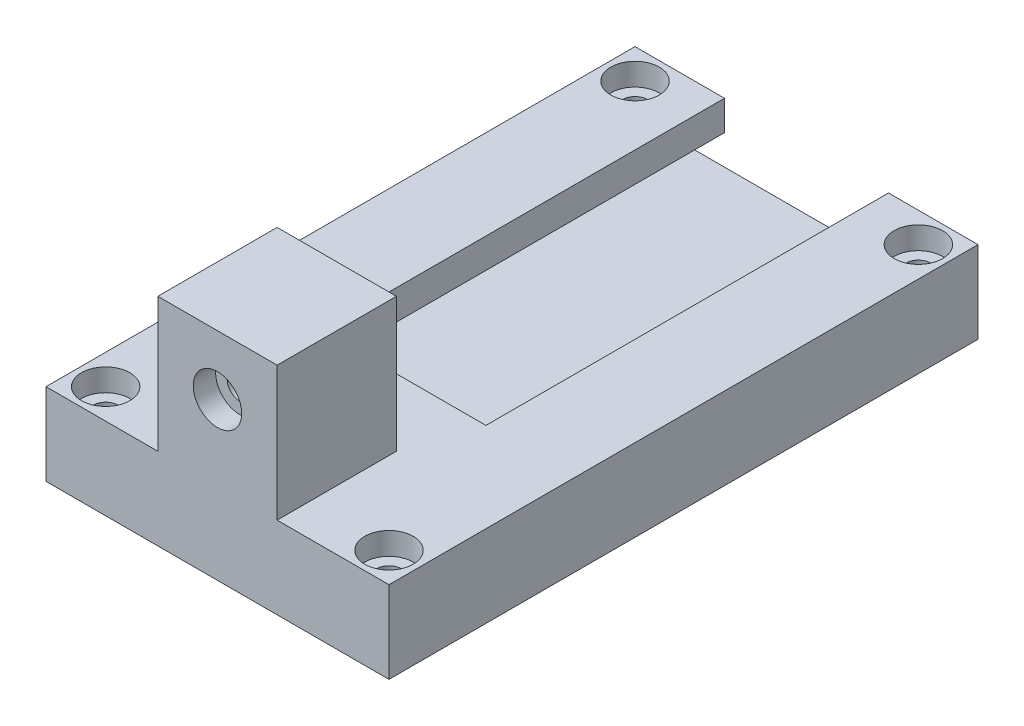
ISO-10303-21;
HEADER;
FILE_DESCRIPTION(('STEP AP214'),'2;1');
FILE_NAME('part.step','',(''),(''),'','','');
FILE_SCHEMA(('AUTOMOTIVE_DESIGN { 1 0 10303 214 1 1 1 1 }'));
ENDSEC;
DATA;
#1=APPLICATION_CONTEXT('core data for automotive mechanical design processes');
#2=APPLICATION_PROTOCOL_DEFINITION('international standard','automotive_design',2000,#1);
#3=PRODUCT_CONTEXT('',#1,'mechanical');
#4=PRODUCT('Part','Part','',(#3));
#5=PRODUCT_RELATED_PRODUCT_CATEGORY('part','',(#4));
#6=PRODUCT_DEFINITION_FORMATION('','',#4);
#7=PRODUCT_DEFINITION_CONTEXT('part definition',#1,'design');
#8=PRODUCT_DEFINITION('design','',#6,#7);
#9=PRODUCT_DEFINITION_SHAPE('','',#8);
#10=(LENGTH_UNIT() NAMED_UNIT(*) SI_UNIT(.MILLI.,.METRE.));
#11=(NAMED_UNIT(*) PLANE_ANGLE_UNIT() SI_UNIT($,.RADIAN.));
#12=(NAMED_UNIT(*) SI_UNIT($,.STERADIAN.) SOLID_ANGLE_UNIT());
#13=UNCERTAINTY_MEASURE_WITH_UNIT(LENGTH_MEASURE(1.E-05),#10,'distance_accuracy_value','');
#14=(GEOMETRIC_REPRESENTATION_CONTEXT(3) GLOBAL_UNCERTAINTY_ASSIGNED_CONTEXT((#13)) GLOBAL_UNIT_ASSIGNED_CONTEXT((#10,
#11,#12)) REPRESENTATION_CONTEXT('',''));
#15=CARTESIAN_POINT('',(0.,0.,0.));
#16=DIRECTION('',(0.,0.,1.));
#17=DIRECTION('',(1.,0.,0.));
#18=AXIS2_PLACEMENT_3D('',#15,#16,#17);
#19=CARTESIAN_POINT('',(0.,11.,54.));
#20=DIRECTION('',(0.,-1.,0.));
#21=DIRECTION('',(1.,0.,0.));
#22=AXIS2_PLACEMENT_3D('',#19,#20,#21);
#23=PLANE('',#22);
#24=CARTESIAN_POINT('',(4.00000000000001,11.,75.));
#25=DIRECTION('',(0.,1.,0.));
#26=DIRECTION('',(0.,0.,1.));
#27=AXIS2_PLACEMENT_3D('',#24,#25,#26);
#28=CIRCLE('',#27,3.25);
#29=CARTESIAN_POINT('',(4.00000000000001,11.,78.25));
#30=VERTEX_POINT('',#29);
#31=EDGE_CURVE('E207',#30,#30,#28,.T.);
#32=ORIENTED_EDGE('',*,*,#31,.F.);
#33=EDGE_LOOP('',(#32));
#34=FACE_BOUND('',#33,.T.);
#35=CARTESIAN_POINT('',(4.,11.,4.00000000000001));
#36=DIRECTION('',(0.,1.,0.));
#37=DIRECTION('',(0.,0.,1.));
#38=AXIS2_PLACEMENT_3D('',#35,#36,#37);
#39=CIRCLE('',#38,3.25);
#40=CARTESIAN_POINT('',(4.,11.,7.25));
#41=VERTEX_POINT('',#40);
#42=EDGE_CURVE('E195',#41,#41,#39,.T.);
#43=ORIENTED_EDGE('',*,*,#42,.F.);
#44=EDGE_LOOP('',(#43));
#45=FACE_BOUND('',#44,.T.);
#46=CARTESIAN_POINT('',(42.,11.,75.));
#47=DIRECTION('',(0.,1.,0.));
#48=DIRECTION('',(0.,0.,1.));
#49=AXIS2_PLACEMENT_3D('',#46,#47,#48);
#50=CIRCLE('',#49,3.25);
#51=CARTESIAN_POINT('',(42.,11.,78.25));
#52=VERTEX_POINT('',#51);
#53=EDGE_CURVE('E185',#52,#52,#50,.T.);
#54=ORIENTED_EDGE('',*,*,#53,.F.);
#55=EDGE_LOOP('',(#54));
#56=FACE_BOUND('',#55,.T.);
#57=CARTESIAN_POINT('',(42.,11.,4.));
#58=DIRECTION('',(0.,1.,0.));
#59=DIRECTION('',(0.,0.,1.));
#60=AXIS2_PLACEMENT_3D('',#57,#58,#59);
#61=CIRCLE('',#60,3.25);
#62=CARTESIAN_POINT('',(42.,11.,7.25));
#63=VERTEX_POINT('',#62);
#64=EDGE_CURVE('E174',#63,#63,#61,.T.);
#65=ORIENTED_EDGE('',*,*,#64,.F.);
#66=EDGE_LOOP('',(#65));
#67=FACE_BOUND('',#66,.T.);
#68=DIRECTION('',(0.,0.,1.));
#69=VECTOR('',#68,1.);
#70=CARTESIAN_POINT('',(15.,11.,79.));
#71=LINE('',#70,#69);
#72=CARTESIAN_POINT('',(15.,11.,63.));
#73=VERTEX_POINT('',#72);
#74=CARTESIAN_POINT('',(15.,11.,79.));
#75=VERTEX_POINT('',#74);
#76=EDGE_CURVE('E51',#73,#75,#71,.T.);
#77=ORIENTED_EDGE('',*,*,#76,.F.);
#78=DIRECTION('',(-1.,0.,0.));
#79=VECTOR('',#78,1.);
#80=CARTESIAN_POINT('',(15.,11.,63.));
#81=LINE('',#80,#79);
#82=CARTESIAN_POINT('',(31.,11.,63.));
#83=VERTEX_POINT('',#82);
#84=EDGE_CURVE('E352',#83,#73,#81,.T.);
#85=ORIENTED_EDGE('',*,*,#84,.F.);
#86=DIRECTION('',(0.,0.,-1.));
#87=VECTOR('',#86,1.);
#88=CARTESIAN_POINT('',(31.,11.,63.));
#89=LINE('',#88,#87);
#90=CARTESIAN_POINT('',(31.,11.,79.));
#91=VERTEX_POINT('',#90);
#92=EDGE_CURVE('E354',#91,#83,#89,.T.);
#93=ORIENTED_EDGE('',*,*,#92,.F.);
#94=DIRECTION('',(-1.,0.,0.));
#95=VECTOR('',#94,1.);
#96=CARTESIAN_POINT('',(34.,11.,79.));
#97=LINE('',#96,#95);
#98=CARTESIAN_POINT('',(46.,11.,79.));
#99=VERTEX_POINT('',#98);
#100=EDGE_CURVE('E173',#99,#91,#97,.T.);
#101=ORIENTED_EDGE('',*,*,#100,.F.);
#102=DIRECTION('',(0.,0.,-1.));
#103=VECTOR('',#102,1.);
#104=CARTESIAN_POINT('',(46.,11.,54.));
#105=LINE('',#104,#103);
#106=CARTESIAN_POINT('',(46.,11.,0.));
#107=VERTEX_POINT('',#106);
#108=EDGE_CURVE('E44',#99,#107,#105,.T.);
#109=ORIENTED_EDGE('',*,*,#108,.T.);
#110=DIRECTION('',(-1.,0.,0.));
#111=VECTOR('',#110,1.);
#112=CARTESIAN_POINT('',(34.,11.,0.));
#113=LINE('',#112,#111);
#114=CARTESIAN_POINT('',(34.,11.,0.));
#115=VERTEX_POINT('',#114);
#116=EDGE_CURVE('E266',#107,#115,#113,.T.);
#117=ORIENTED_EDGE('',*,*,#116,.T.);
#118=DIRECTION('',(0.,0.,-1.));
#119=VECTOR('',#118,1.);
#120=CARTESIAN_POINT('',(34.,11.,54.));
#121=LINE('',#120,#119);
#122=CARTESIAN_POINT('',(34.,11.,54.));
#123=VERTEX_POINT('',#122);
#124=EDGE_CURVE('E311',#123,#115,#121,.T.);
#125=ORIENTED_EDGE('',*,*,#124,.F.);
#126=DIRECTION('',(-1.,0.,0.));
#127=VECTOR('',#126,1.);
#128=CARTESIAN_POINT('',(0.,11.,54.));
#129=LINE('',#128,#127);
#130=CARTESIAN_POINT('',(12.,11.,54.));
#131=VERTEX_POINT('',#130);
#132=EDGE_CURVE('E219',#123,#131,#129,.T.);
#133=ORIENTED_EDGE('',*,*,#132,.T.);
#134=DIRECTION('',(0.,0.,-1.));
#135=VECTOR('',#134,1.);
#136=CARTESIAN_POINT('',(12.,11.,54.));
#137=LINE('',#136,#135);
#138=CARTESIAN_POINT('',(12.,11.,0.));
#139=VERTEX_POINT('',#138);
#140=EDGE_CURVE('E290',#131,#139,#137,.T.);
#141=ORIENTED_EDGE('',*,*,#140,.T.);
#142=DIRECTION('',(-1.,0.,0.));
#143=VECTOR('',#142,1.);
#144=CARTESIAN_POINT('',(0.,11.,0.));
#145=LINE('',#144,#143);
#146=CARTESIAN_POINT('',(0.,11.,0.));
#147=VERTEX_POINT('',#146);
#148=EDGE_CURVE('E282',#139,#147,#145,.T.);
#149=ORIENTED_EDGE('',*,*,#148,.T.);
#150=DIRECTION('',(0.,0.,-1.));
#151=VECTOR('',#150,1.);
#152=CARTESIAN_POINT('',(0.,11.,54.));
#153=LINE('',#152,#151);
#154=CARTESIAN_POINT('',(0.,11.,79.));
#155=VERTEX_POINT('',#154);
#156=EDGE_CURVE('E287',#155,#147,#153,.T.);
#157=ORIENTED_EDGE('',*,*,#156,.F.);
#158=EDGE_CURVE('E56',#75,#155,#97,.T.);
#159=ORIENTED_EDGE('',*,*,#158,.F.);
#160=EDGE_LOOP('',(#77,#85,#93,#101,#109,#117,#125,#133,#141,#149,#157,#159));
#161=FACE_BOUND('',#160,.T.);
#162=ADVANCED_FACE('F35',(#34,#45,#56,#67,#161),#23,.F.);
#163=CARTESIAN_POINT('',(46.,0.,54.));
#164=DIRECTION('',(0.,1.,0.));
#165=DIRECTION('',(-1.,0.,0.));
#166=AXIS2_PLACEMENT_3D('',#163,#164,#165);
#167=PLANE('',#166);
#168=CARTESIAN_POINT('',(42.,0.,4.));
#169=DIRECTION('',(0.,1.,0.));
#170=DIRECTION('',(-1.,0.,0.));
#171=AXIS2_PLACEMENT_3D('',#168,#169,#170);
#172=CIRCLE('',#171,1.7);
#173=CARTESIAN_POINT('',(40.3,0.,4.));
#174=VERTEX_POINT('',#173);
#175=EDGE_CURVE('E183',#174,#174,#172,.F.);
#176=ORIENTED_EDGE('',*,*,#175,.F.);
#177=EDGE_LOOP('',(#176));
#178=FACE_BOUND('',#177,.T.);
#179=CARTESIAN_POINT('',(42.,0.,75.));
#180=DIRECTION('',(0.,1.,0.));
#181=DIRECTION('',(-1.,0.,0.));
#182=AXIS2_PLACEMENT_3D('',#179,#180,#181);
#183=CIRCLE('',#182,1.7);
#184=CARTESIAN_POINT('',(40.3,0.,75.));
#185=VERTEX_POINT('',#184);
#186=EDGE_CURVE('E192',#185,#185,#183,.F.);
#187=ORIENTED_EDGE('',*,*,#186,.F.);
#188=EDGE_LOOP('',(#187));
#189=FACE_BOUND('',#188,.T.);
#190=CARTESIAN_POINT('',(4.,0.,4.00000000000001));
#191=DIRECTION('',(0.,1.,0.));
#192=DIRECTION('',(-1.,0.,0.));
#193=AXIS2_PLACEMENT_3D('',#190,#191,#192);
#194=CIRCLE('',#193,1.7);
#195=CARTESIAN_POINT('',(2.3,0.,4.00000000000001));
#196=VERTEX_POINT('',#195);
#197=EDGE_CURVE('E204',#196,#196,#194,.F.);
#198=ORIENTED_EDGE('',*,*,#197,.F.);
#199=EDGE_LOOP('',(#198));
#200=FACE_BOUND('',#199,.T.);
#201=CARTESIAN_POINT('',(4.00000000000001,0.,75.));
#202=DIRECTION('',(0.,1.,0.));
#203=DIRECTION('',(-1.,0.,0.));
#204=AXIS2_PLACEMENT_3D('',#201,#202,#203);
#205=CIRCLE('',#204,1.7);
#206=CARTESIAN_POINT('',(2.30000000000001,0.,75.));
#207=VERTEX_POINT('',#206);
#208=EDGE_CURVE('E216',#207,#207,#205,.F.);
#209=ORIENTED_EDGE('',*,*,#208,.F.);
#210=EDGE_LOOP('',(#209));
#211=FACE_BOUND('',#210,.T.);
#212=DIRECTION('',(1.,0.,0.));
#213=VECTOR('',#212,1.);
#214=CARTESIAN_POINT('',(46.,0.,0.));
#215=LINE('',#214,#213);
#216=CARTESIAN_POINT('',(0.,0.,0.));
#217=VERTEX_POINT('',#216);
#218=CARTESIAN_POINT('',(46.,0.,0.));
#219=VERTEX_POINT('',#218);
#220=EDGE_CURVE('E236',#217,#219,#215,.T.);
#221=ORIENTED_EDGE('',*,*,#220,.T.);
#222=DIRECTION('',(0.,0.,-1.));
#223=VECTOR('',#222,1.);
#224=CARTESIAN_POINT('',(46.,0.,54.));
#225=LINE('',#224,#223);
#226=CARTESIAN_POINT('',(46.,0.,79.));
#227=VERTEX_POINT('',#226);
#228=EDGE_CURVE('E11',#227,#219,#225,.T.);
#229=ORIENTED_EDGE('',*,*,#228,.F.);
#230=DIRECTION('',(1.,0.,0.));
#231=VECTOR('',#230,1.);
#232=CARTESIAN_POINT('',(46.,0.,79.));
#233=LINE('',#232,#231);
#234=CARTESIAN_POINT('',(0.,0.,79.));
#235=VERTEX_POINT('',#234);
#236=EDGE_CURVE('E230',#235,#227,#233,.T.);
#237=ORIENTED_EDGE('',*,*,#236,.F.);
#238=DIRECTION('',(0.,0.,-1.));
#239=VECTOR('',#238,1.);
#240=CARTESIAN_POINT('',(0.,0.,54.));
#241=LINE('',#240,#239);
#242=EDGE_CURVE('E261',#235,#217,#241,.T.);
#243=ORIENTED_EDGE('',*,*,#242,.T.);
#244=EDGE_LOOP('',(#221,#229,#237,#243));
#245=FACE_BOUND('',#244,.T.);
#246=ADVANCED_FACE('F37',(#178,#189,#200,#211,#245),#167,.F.);
#247=CARTESIAN_POINT('',(46.,11.,54.));
#248=DIRECTION('',(-1.,0.,0.));
#249=DIRECTION('',(0.,0.,1.));
#250=AXIS2_PLACEMENT_3D('',#247,#248,#249);
#251=PLANE('',#250);
#252=DIRECTION('',(0.,1.,0.));
#253=VECTOR('',#252,1.);
#254=CARTESIAN_POINT('',(46.,11.,0.));
#255=LINE('',#254,#253);
#256=EDGE_CURVE('E264',#219,#107,#255,.T.);
#257=ORIENTED_EDGE('',*,*,#256,.T.);
#258=ORIENTED_EDGE('',*,*,#108,.F.);
#259=DIRECTION('',(0.,1.,0.));
#260=VECTOR('',#259,1.);
#261=CARTESIAN_POINT('',(46.,11.,79.));
#262=LINE('',#261,#260);
#263=EDGE_CURVE('E233',#227,#99,#262,.T.);
#264=ORIENTED_EDGE('',*,*,#263,.F.);
#265=ORIENTED_EDGE('',*,*,#228,.T.);
#266=EDGE_LOOP('',(#257,#258,#264,#265));
#267=FACE_BOUND('',#266,.T.);
#268=ADVANCED_FACE('F385',(#267),#251,.F.);
#269=CARTESIAN_POINT('',(34.,7.00000000000001,54.));
#270=DIRECTION('',(1.,0.,0.));
#271=DIRECTION('',(0.,0.,-1.));
#272=AXIS2_PLACEMENT_3D('',#269,#270,#271);
#273=PLANE('',#272);
#274=DIRECTION('',(0.,-1.,0.));
#275=VECTOR('',#274,1.);
#276=CARTESIAN_POINT('',(34.,7.00000000000001,0.));
#277=LINE('',#276,#275);
#278=CARTESIAN_POINT('',(34.,7.00000000000001,0.));
#279=VERTEX_POINT('',#278);
#280=EDGE_CURVE('E268',#115,#279,#277,.T.);
#281=ORIENTED_EDGE('',*,*,#280,.T.);
#282=DIRECTION('',(0.,0.,-1.));
#283=VECTOR('',#282,1.);
#284=CARTESIAN_POINT('',(34.,7.00000000000001,54.));
#285=LINE('',#284,#283);
#286=CARTESIAN_POINT('',(34.,7.00000000000001,54.));
#287=VERTEX_POINT('',#286);
#288=EDGE_CURVE('E308',#287,#279,#285,.T.);
#289=ORIENTED_EDGE('',*,*,#288,.F.);
#290=DIRECTION('',(0.,-1.,0.));
#291=VECTOR('',#290,1.);
#292=CARTESIAN_POINT('',(34.,7.00000000000001,54.));
#293=LINE('',#292,#291);
#294=EDGE_CURVE('E239',#123,#287,#293,.T.);
#295=ORIENTED_EDGE('',*,*,#294,.F.);
#296=ORIENTED_EDGE('',*,*,#124,.T.);
#297=EDGE_LOOP('',(#281,#289,#295,#296));
#298=FACE_BOUND('',#297,.T.);
#299=ADVANCED_FACE('F325',(#298),#273,.F.);
#300=CARTESIAN_POINT('',(38.,7.00000000000001,54.));
#301=DIRECTION('',(0.,1.,0.));
#302=DIRECTION('',(-1.,0.,0.));
#303=AXIS2_PLACEMENT_3D('',#300,#301,#302);
#304=PLANE('',#303);
#305=DIRECTION('',(1.,0.,0.));
#306=VECTOR('',#305,1.);
#307=CARTESIAN_POINT('',(38.,7.00000000000001,0.));
#308=LINE('',#307,#306);
#309=CARTESIAN_POINT('',(38.,7.00000000000001,0.));
#310=VERTEX_POINT('',#309);
#311=EDGE_CURVE('E270',#279,#310,#308,.T.);
#312=ORIENTED_EDGE('',*,*,#311,.T.);
#313=DIRECTION('',(0.,0.,-1.));
#314=VECTOR('',#313,1.);
#315=CARTESIAN_POINT('',(38.,7.00000000000001,54.));
#316=LINE('',#315,#314);
#317=CARTESIAN_POINT('',(38.,7.00000000000001,54.));
#318=VERTEX_POINT('',#317);
#319=EDGE_CURVE('E305',#318,#310,#316,.T.);
#320=ORIENTED_EDGE('',*,*,#319,.F.);
#321=DIRECTION('',(1.,0.,0.));
#322=VECTOR('',#321,1.);
#323=CARTESIAN_POINT('',(38.,7.00000000000001,54.));
#324=LINE('',#323,#322);
#325=EDGE_CURVE('E242',#287,#318,#324,.T.);
#326=ORIENTED_EDGE('',*,*,#325,.F.);
#327=ORIENTED_EDGE('',*,*,#288,.T.);
#328=EDGE_LOOP('',(#312,#320,#326,#327));
#329=FACE_BOUND('',#328,.T.);
#330=ADVANCED_FACE('F329',(#329),#304,.F.);
#331=CARTESIAN_POINT('',(38.,3.,54.));
#332=DIRECTION('',(1.,0.,0.));
#333=DIRECTION('',(0.,0.,-1.));
#334=AXIS2_PLACEMENT_3D('',#331,#332,#333);
#335=PLANE('',#334);
#336=DIRECTION('',(0.,-1.,0.));
#337=VECTOR('',#336,1.);
#338=CARTESIAN_POINT('',(38.,3.,0.));
#339=LINE('',#338,#337);
#340=CARTESIAN_POINT('',(38.,3.,0.));
#341=VERTEX_POINT('',#340);
#342=EDGE_CURVE('E272',#310,#341,#339,.T.);
#343=ORIENTED_EDGE('',*,*,#342,.T.);
#344=DIRECTION('',(0.,0.,-1.));
#345=VECTOR('',#344,1.);
#346=CARTESIAN_POINT('',(38.,3.,54.));
#347=LINE('',#346,#345);
#348=CARTESIAN_POINT('',(38.,3.,54.));
#349=VERTEX_POINT('',#348);
#350=EDGE_CURVE('E302',#349,#341,#347,.T.);
#351=ORIENTED_EDGE('',*,*,#350,.F.);
#352=DIRECTION('',(0.,-1.,0.));
#353=VECTOR('',#352,1.);
#354=CARTESIAN_POINT('',(38.,3.,54.));
#355=LINE('',#354,#353);
#356=EDGE_CURVE('E246',#318,#349,#355,.T.);
#357=ORIENTED_EDGE('',*,*,#356,.F.);
#358=ORIENTED_EDGE('',*,*,#319,.T.);
#359=EDGE_LOOP('',(#343,#351,#357,#358));
#360=FACE_BOUND('',#359,.T.);
#361=ADVANCED_FACE('F405',(#360),#335,.F.);
#362=CARTESIAN_POINT('',(8.,3.,54.));
#363=DIRECTION('',(0.,-1.,0.));
#364=DIRECTION('',(1.,0.,0.));
#365=AXIS2_PLACEMENT_3D('',#362,#363,#364);
#366=PLANE('',#365);
#367=DIRECTION('',(-1.,0.,0.));
#368=VECTOR('',#367,1.);
#369=CARTESIAN_POINT('',(8.,3.,0.));
#370=LINE('',#369,#368);
#371=CARTESIAN_POINT('',(8.,3.,0.));
#372=VERTEX_POINT('',#371);
#373=EDGE_CURVE('E274',#341,#372,#370,.T.);
#374=ORIENTED_EDGE('',*,*,#373,.T.);
#375=DIRECTION('',(0.,0.,-1.));
#376=VECTOR('',#375,1.);
#377=CARTESIAN_POINT('',(8.,3.,54.));
#378=LINE('',#377,#376);
#379=CARTESIAN_POINT('',(8.,3.,54.));
#380=VERTEX_POINT('',#379);
#381=EDGE_CURVE('E299',#380,#372,#378,.T.);
#382=ORIENTED_EDGE('',*,*,#381,.F.);
#383=DIRECTION('',(-1.,0.,0.));
#384=VECTOR('',#383,1.);
#385=CARTESIAN_POINT('',(8.,3.,54.));
#386=LINE('',#385,#384);
#387=EDGE_CURVE('E249',#349,#380,#386,.T.);
#388=ORIENTED_EDGE('',*,*,#387,.F.);
#389=ORIENTED_EDGE('',*,*,#350,.T.);
#390=EDGE_LOOP('',(#374,#382,#388,#389));
#391=FACE_BOUND('',#390,.T.);
#392=ADVANCED_FACE('F401',(#391),#366,.F.);
#393=CARTESIAN_POINT('',(8.,7.,54.));
#394=DIRECTION('',(-1.,0.,0.));
#395=DIRECTION('',(0.,0.,1.));
#396=AXIS2_PLACEMENT_3D('',#393,#394,#395);
#397=PLANE('',#396);
#398=DIRECTION('',(0.,1.,0.));
#399=VECTOR('',#398,1.);
#400=CARTESIAN_POINT('',(8.,7.,0.));
#401=LINE('',#400,#399);
#402=CARTESIAN_POINT('',(8.,7.,0.));
#403=VERTEX_POINT('',#402);
#404=EDGE_CURVE('E276',#372,#403,#401,.T.);
#405=ORIENTED_EDGE('',*,*,#404,.T.);
#406=DIRECTION('',(0.,0.,-1.));
#407=VECTOR('',#406,1.);
#408=CARTESIAN_POINT('',(8.,7.,54.));
#409=LINE('',#408,#407);
#410=CARTESIAN_POINT('',(8.,7.,54.));
#411=VERTEX_POINT('',#410);
#412=EDGE_CURVE('E296',#411,#403,#409,.T.);
#413=ORIENTED_EDGE('',*,*,#412,.F.);
#414=DIRECTION('',(0.,1.,0.));
#415=VECTOR('',#414,1.);
#416=CARTESIAN_POINT('',(8.,7.,54.));
#417=LINE('',#416,#415);
#418=EDGE_CURVE('E252',#380,#411,#417,.T.);
#419=ORIENTED_EDGE('',*,*,#418,.F.);
#420=ORIENTED_EDGE('',*,*,#381,.T.);
#421=EDGE_LOOP('',(#405,#413,#419,#420));
#422=FACE_BOUND('',#421,.T.);
#423=ADVANCED_FACE('F397',(#422),#397,.F.);
#424=CARTESIAN_POINT('',(12.,7.,54.));
#425=DIRECTION('',(0.,1.,0.));
#426=DIRECTION('',(-1.,0.,0.));
#427=AXIS2_PLACEMENT_3D('',#424,#425,#426);
#428=PLANE('',#427);
#429=DIRECTION('',(1.,0.,0.));
#430=VECTOR('',#429,1.);
#431=CARTESIAN_POINT('',(12.,7.,0.));
#432=LINE('',#431,#430);
#433=CARTESIAN_POINT('',(12.,7.,0.));
#434=VERTEX_POINT('',#433);
#435=EDGE_CURVE('E278',#403,#434,#432,.T.);
#436=ORIENTED_EDGE('',*,*,#435,.T.);
#437=DIRECTION('',(0.,0.,-1.));
#438=VECTOR('',#437,1.);
#439=CARTESIAN_POINT('',(12.,7.,54.));
#440=LINE('',#439,#438);
#441=CARTESIAN_POINT('',(12.,7.,54.));
#442=VERTEX_POINT('',#441);
#443=EDGE_CURVE('E293',#442,#434,#440,.T.);
#444=ORIENTED_EDGE('',*,*,#443,.F.);
#445=DIRECTION('',(1.,0.,0.));
#446=VECTOR('',#445,1.);
#447=CARTESIAN_POINT('',(12.,7.,54.));
#448=LINE('',#447,#446);
#449=EDGE_CURVE('E255',#411,#442,#448,.T.);
#450=ORIENTED_EDGE('',*,*,#449,.F.);
#451=ORIENTED_EDGE('',*,*,#412,.T.);
#452=EDGE_LOOP('',(#436,#444,#450,#451));
#453=FACE_BOUND('',#452,.T.);
#454=ADVANCED_FACE('F394',(#453),#428,.F.);
#455=CARTESIAN_POINT('',(12.,11.,54.));
#456=DIRECTION('',(-1.,0.,0.));
#457=DIRECTION('',(0.,0.,1.));
#458=AXIS2_PLACEMENT_3D('',#455,#456,#457);
#459=PLANE('',#458);
#460=DIRECTION('',(0.,1.,0.));
#461=VECTOR('',#460,1.);
#462=CARTESIAN_POINT('',(12.,11.,0.));
#463=LINE('',#462,#461);
#464=EDGE_CURVE('E280',#434,#139,#463,.T.);
#465=ORIENTED_EDGE('',*,*,#464,.T.);
#466=ORIENTED_EDGE('',*,*,#140,.F.);
#467=DIRECTION('',(0.,1.,0.));
#468=VECTOR('',#467,1.);
#469=CARTESIAN_POINT('',(12.,11.,54.));
#470=LINE('',#469,#468);
#471=EDGE_CURVE('E258',#442,#131,#470,.T.);
#472=ORIENTED_EDGE('',*,*,#471,.F.);
#473=ORIENTED_EDGE('',*,*,#443,.T.);
#474=EDGE_LOOP('',(#465,#466,#472,#473));
#475=FACE_BOUND('',#474,.T.);
#476=ADVANCED_FACE('F391',(#475),#459,.F.);
#477=CARTESIAN_POINT('',(0.,0.,54.));
#478=DIRECTION('',(1.,0.,0.));
#479=DIRECTION('',(0.,1.,0.));
#480=AXIS2_PLACEMENT_3D('',#477,#478,#479);
#481=PLANE('',#480);
#482=DIRECTION('',(0.,-1.,0.));
#483=VECTOR('',#482,1.);
#484=CARTESIAN_POINT('',(0.,0.,0.));
#485=LINE('',#484,#483);
#486=EDGE_CURVE('E243',#147,#217,#485,.T.);
#487=ORIENTED_EDGE('',*,*,#486,.T.);
#488=ORIENTED_EDGE('',*,*,#242,.F.);
#489=DIRECTION('',(0.,-1.,0.));
#490=VECTOR('',#489,1.);
#491=CARTESIAN_POINT('',(0.,0.,79.));
#492=LINE('',#491,#490);
#493=EDGE_CURVE('E228',#155,#235,#492,.T.);
#494=ORIENTED_EDGE('',*,*,#493,.F.);
#495=ORIENTED_EDGE('',*,*,#156,.T.);
#496=EDGE_LOOP('',(#487,#488,#494,#495));
#497=FACE_BOUND('',#496,.T.);
#498=ADVANCED_FACE('F341',(#497),#481,.F.);
#499=CARTESIAN_POINT('',(0.,0.,0.));
#500=DIRECTION('',(0.,0.,-1.));
#501=DIRECTION('',(-1.,0.,0.));
#502=AXIS2_PLACEMENT_3D('',#499,#500,#501);
#503=PLANE('',#502);
#504=ORIENTED_EDGE('',*,*,#220,.F.);
#505=ORIENTED_EDGE('',*,*,#486,.F.);
#506=ORIENTED_EDGE('',*,*,#148,.F.);
#507=ORIENTED_EDGE('',*,*,#464,.F.);
#508=ORIENTED_EDGE('',*,*,#435,.F.);
#509=ORIENTED_EDGE('',*,*,#404,.F.);
#510=ORIENTED_EDGE('',*,*,#373,.F.);
#511=ORIENTED_EDGE('',*,*,#342,.F.);
#512=ORIENTED_EDGE('',*,*,#311,.F.);
#513=ORIENTED_EDGE('',*,*,#280,.F.);
#514=ORIENTED_EDGE('',*,*,#116,.F.);
#515=ORIENTED_EDGE('',*,*,#256,.F.);
#516=EDGE_LOOP('',(#504,#505,#506,#507,#508,#509,#510,#511,#512,#513,#514,#515));
#517=FACE_BOUND('',#516,.T.);
#518=ADVANCED_FACE('F321',(#517),#503,.T.);
#519=CARTESIAN_POINT('',(0.,0.,79.));
#520=DIRECTION('',(0.,0.,-1.));
#521=DIRECTION('',(-1.,0.,0.));
#522=AXIS2_PLACEMENT_3D('',#519,#520,#521);
#523=PLANE('',#522);
#524=CARTESIAN_POINT('',(23.,21.,79.));
#525=DIRECTION('',(0.,0.,1.));
#526=DIRECTION('',(1.,0.,0.));
#527=AXIS2_PLACEMENT_3D('',#524,#525,#526);
#528=CIRCLE('',#527,3.25);
#529=CARTESIAN_POINT('',(26.25,21.,79.));
#530=VERTEX_POINT('',#529);
#531=EDGE_CURVE('E363',#530,#530,#528,.T.);
#532=ORIENTED_EDGE('',*,*,#531,.F.);
#533=EDGE_LOOP('',(#532));
#534=FACE_BOUND('',#533,.T.);
#535=ORIENTED_EDGE('',*,*,#493,.T.);
#536=ORIENTED_EDGE('',*,*,#236,.T.);
#537=ORIENTED_EDGE('',*,*,#263,.T.);
#538=ORIENTED_EDGE('',*,*,#100,.T.);
#539=DIRECTION('',(0.,-1.,0.));
#540=VECTOR('',#539,1.);
#541=CARTESIAN_POINT('',(31.,29.,79.));
#542=LINE('',#541,#540);
#543=CARTESIAN_POINT('',(31.,29.,79.));
#544=VERTEX_POINT('',#543);
#545=EDGE_CURVE('E152',#544,#91,#542,.T.);
#546=ORIENTED_EDGE('',*,*,#545,.F.);
#547=DIRECTION('',(1.,0.,0.));
#548=VECTOR('',#547,1.);
#549=CARTESIAN_POINT('',(31.,29.,79.));
#550=LINE('',#549,#548);
#551=CARTESIAN_POINT('',(15.,29.,79.));
#552=VERTEX_POINT('',#551);
#553=EDGE_CURVE('E158',#552,#544,#550,.T.);
#554=ORIENTED_EDGE('',*,*,#553,.F.);
#555=DIRECTION('',(0.,-1.,0.));
#556=VECTOR('',#555,1.);
#557=CARTESIAN_POINT('',(15.,29.,79.));
#558=LINE('',#557,#556);
#559=EDGE_CURVE('E345',#552,#75,#558,.T.);
#560=ORIENTED_EDGE('',*,*,#559,.T.);
#561=ORIENTED_EDGE('',*,*,#158,.T.);
#562=EDGE_LOOP('',(#535,#536,#537,#538,#546,#554,#560,#561));
#563=FACE_BOUND('',#562,.T.);
#564=ADVANCED_FACE('F170',(#534,#563),#523,.F.);
#565=CARTESIAN_POINT('',(0.,0.,54.));
#566=DIRECTION('',(0.,0.,-1.));
#567=DIRECTION('',(-1.,0.,0.));
#568=AXIS2_PLACEMENT_3D('',#565,#566,#567);
#569=PLANE('',#568);
#570=ORIENTED_EDGE('',*,*,#132,.F.);
#571=ORIENTED_EDGE('',*,*,#294,.T.);
#572=ORIENTED_EDGE('',*,*,#325,.T.);
#573=ORIENTED_EDGE('',*,*,#356,.T.);
#574=ORIENTED_EDGE('',*,*,#387,.T.);
#575=ORIENTED_EDGE('',*,*,#418,.T.);
#576=ORIENTED_EDGE('',*,*,#449,.T.);
#577=ORIENTED_EDGE('',*,*,#471,.T.);
#578=EDGE_LOOP('',(#570,#571,#572,#573,#574,#575,#576,#577));
#579=FACE_BOUND('',#578,.T.);
#580=ADVANCED_FACE('F333',(#579),#569,.T.);
#581=CARTESIAN_POINT('',(4.00000000000001,11.,75.));
#582=DIRECTION('',(0.,1.,0.));
#583=DIRECTION('',(0.,0.,1.));
#584=AXIS2_PLACEMENT_3D('',#581,#582,#583);
#585=CYLINDRICAL_SURFACE('',#584,1.7);
#586=ORIENTED_EDGE('',*,*,#208,.T.);
#587=EDGE_LOOP('',(#586));
#588=FACE_BOUND('',#587,.T.);
#589=CARTESIAN_POINT('',(4.00000000000001,8.00000000000001,75.));
#590=DIRECTION('',(0.,1.,0.));
#591=DIRECTION('',(0.,0.,1.));
#592=AXIS2_PLACEMENT_3D('',#589,#590,#591);
#593=CIRCLE('',#592,1.69999999999999);
#594=CARTESIAN_POINT('',(4.00000000000001,8.00000000000001,76.7));
#595=VERTEX_POINT('',#594);
#596=EDGE_CURVE('E220',#595,#595,#593,.T.);
#597=ORIENTED_EDGE('',*,*,#596,.T.);
#598=EDGE_LOOP('',(#597));
#599=FACE_BOUND('',#598,.T.);
#600=ADVANCED_FACE('F375',(#588,#599),#585,.F.);
#601=CARTESIAN_POINT('',(5.7,8.00000000000001,75.));
#602=DIRECTION('',(0.,-1.,0.));
#603=DIRECTION('',(0.,0.,-1.));
#604=AXIS2_PLACEMENT_3D('',#601,#602,#603);
#605=PLANE('',#604);
#606=ORIENTED_EDGE('',*,*,#596,.F.);
#607=EDGE_LOOP('',(#606));
#608=FACE_BOUND('',#607,.T.);
#609=CARTESIAN_POINT('',(4.00000000000001,8.00000000000001,75.));
#610=DIRECTION('',(0.,1.,0.));
#611=DIRECTION('',(0.,0.,1.));
#612=AXIS2_PLACEMENT_3D('',#609,#610,#611);
#613=CIRCLE('',#612,3.25);
#614=CARTESIAN_POINT('',(4.00000000000001,8.00000000000001,78.25));
#615=VERTEX_POINT('',#614);
#616=EDGE_CURVE('E223',#615,#615,#613,.T.);
#617=ORIENTED_EDGE('',*,*,#616,.T.);
#618=EDGE_LOOP('',(#617));
#619=FACE_BOUND('',#618,.T.);
#620=ADVANCED_FACE('F495',(#608,#619),#605,.F.);
#621=CARTESIAN_POINT('',(4.00000000000001,11.,75.));
#622=DIRECTION('',(0.,1.,0.));
#623=DIRECTION('',(0.,0.,1.));
#624=AXIS2_PLACEMENT_3D('',#621,#622,#623);
#625=CYLINDRICAL_SURFACE('',#624,3.25);
#626=ORIENTED_EDGE('',*,*,#616,.F.);
#627=EDGE_LOOP('',(#626));
#628=FACE_BOUND('',#627,.T.);
#629=ORIENTED_EDGE('',*,*,#31,.T.);
#630=EDGE_LOOP('',(#629));
#631=FACE_BOUND('',#630,.T.);
#632=ADVANCED_FACE('F503',(#628,#631),#625,.F.);
#633=CARTESIAN_POINT('',(4.,11.,4.00000000000001));
#634=DIRECTION('',(0.,1.,0.));
#635=DIRECTION('',(0.,0.,1.));
#636=AXIS2_PLACEMENT_3D('',#633,#634,#635);
#637=CYLINDRICAL_SURFACE('',#636,1.7);
#638=ORIENTED_EDGE('',*,*,#197,.T.);
#639=EDGE_LOOP('',(#638));
#640=FACE_BOUND('',#639,.T.);
#641=CARTESIAN_POINT('',(4.,8.00000000000001,4.00000000000001));
#642=DIRECTION('',(0.,1.,0.));
#643=DIRECTION('',(0.,0.,1.));
#644=AXIS2_PLACEMENT_3D('',#641,#642,#643);
#645=CIRCLE('',#644,1.69999999999999);
#646=CARTESIAN_POINT('',(4.,8.00000000000001,5.7));
#647=VERTEX_POINT('',#646);
#648=EDGE_CURVE('E208',#647,#647,#645,.T.);
#649=ORIENTED_EDGE('',*,*,#648,.T.);
#650=EDGE_LOOP('',(#649));
#651=FACE_BOUND('',#650,.T.);
#652=ADVANCED_FACE('F512',(#640,#651),#637,.F.);
#653=CARTESIAN_POINT('',(5.69999999999999,8.00000000000001,4.00000000000001));
#654=DIRECTION('',(0.,-1.,0.));
#655=DIRECTION('',(0.,0.,-1.));
#656=AXIS2_PLACEMENT_3D('',#653,#654,#655);
#657=PLANE('',#656);
#658=ORIENTED_EDGE('',*,*,#648,.F.);
#659=EDGE_LOOP('',(#658));
#660=FACE_BOUND('',#659,.T.);
#661=CARTESIAN_POINT('',(4.,8.00000000000001,4.00000000000001));
#662=DIRECTION('',(0.,1.,0.));
#663=DIRECTION('',(0.,0.,1.));
#664=AXIS2_PLACEMENT_3D('',#661,#662,#663);
#665=CIRCLE('',#664,3.25);
#666=CARTESIAN_POINT('',(4.,8.00000000000001,7.25));
#667=VERTEX_POINT('',#666);
#668=EDGE_CURVE('E211',#667,#667,#665,.T.);
#669=ORIENTED_EDGE('',*,*,#668,.T.);
#670=EDGE_LOOP('',(#669));
#671=FACE_BOUND('',#670,.T.);
#672=ADVANCED_FACE('F521',(#660,#671),#657,.F.);
#673=CARTESIAN_POINT('',(4.,11.,4.00000000000001));
#674=DIRECTION('',(0.,1.,0.));
#675=DIRECTION('',(0.,0.,1.));
#676=AXIS2_PLACEMENT_3D('',#673,#674,#675);
#677=CYLINDRICAL_SURFACE('',#676,3.25);
#678=ORIENTED_EDGE('',*,*,#668,.F.);
#679=EDGE_LOOP('',(#678));
#680=FACE_BOUND('',#679,.T.);
#681=ORIENTED_EDGE('',*,*,#42,.T.);
#682=EDGE_LOOP('',(#681));
#683=FACE_BOUND('',#682,.T.);
#684=ADVANCED_FACE('F530',(#680,#683),#677,.F.);
#685=CARTESIAN_POINT('',(42.,11.,75.));
#686=DIRECTION('',(0.,1.,0.));
#687=DIRECTION('',(0.,0.,1.));
#688=AXIS2_PLACEMENT_3D('',#685,#686,#687);
#689=CYLINDRICAL_SURFACE('',#688,1.7);
#690=ORIENTED_EDGE('',*,*,#186,.T.);
#691=EDGE_LOOP('',(#690));
#692=FACE_BOUND('',#691,.T.);
#693=CARTESIAN_POINT('',(42.,8.00000000000001,75.));
#694=DIRECTION('',(0.,1.,0.));
#695=DIRECTION('',(0.,0.,1.));
#696=AXIS2_PLACEMENT_3D('',#693,#694,#695);
#697=CIRCLE('',#696,1.69999999999999);
#698=CARTESIAN_POINT('',(42.,8.00000000000001,76.7));
#699=VERTEX_POINT('',#698);
#700=EDGE_CURVE('E196',#699,#699,#697,.T.);
#701=ORIENTED_EDGE('',*,*,#700,.T.);
#702=EDGE_LOOP('',(#701));
#703=FACE_BOUND('',#702,.T.);
#704=ADVANCED_FACE('F539',(#692,#703),#689,.F.);
#705=CARTESIAN_POINT('',(43.7,8.00000000000001,75.));
#706=DIRECTION('',(0.,-1.,0.));
#707=DIRECTION('',(0.,0.,-1.));
#708=AXIS2_PLACEMENT_3D('',#705,#706,#707);
#709=PLANE('',#708);
#710=ORIENTED_EDGE('',*,*,#700,.F.);
#711=EDGE_LOOP('',(#710));
#712=FACE_BOUND('',#711,.T.);
#713=CARTESIAN_POINT('',(42.,8.00000000000001,75.));
#714=DIRECTION('',(0.,1.,0.));
#715=DIRECTION('',(0.,0.,1.));
#716=AXIS2_PLACEMENT_3D('',#713,#714,#715);
#717=CIRCLE('',#716,3.25);
#718=CARTESIAN_POINT('',(42.,8.00000000000001,78.25));
#719=VERTEX_POINT('',#718);
#720=EDGE_CURVE('E199',#719,#719,#717,.T.);
#721=ORIENTED_EDGE('',*,*,#720,.T.);
#722=EDGE_LOOP('',(#721));
#723=FACE_BOUND('',#722,.T.);
#724=ADVANCED_FACE('F548',(#712,#723),#709,.F.);
#725=CARTESIAN_POINT('',(42.,11.,75.));
#726=DIRECTION('',(0.,1.,0.));
#727=DIRECTION('',(0.,0.,1.));
#728=AXIS2_PLACEMENT_3D('',#725,#726,#727);
#729=CYLINDRICAL_SURFACE('',#728,3.25);
#730=ORIENTED_EDGE('',*,*,#720,.F.);
#731=EDGE_LOOP('',(#730));
#732=FACE_BOUND('',#731,.T.);
#733=ORIENTED_EDGE('',*,*,#53,.T.);
#734=EDGE_LOOP('',(#733));
#735=FACE_BOUND('',#734,.T.);
#736=ADVANCED_FACE('F557',(#732,#735),#729,.F.);
#737=CARTESIAN_POINT('',(42.,11.,4.));
#738=DIRECTION('',(0.,1.,0.));
#739=DIRECTION('',(0.,0.,1.));
#740=AXIS2_PLACEMENT_3D('',#737,#738,#739);
#741=CYLINDRICAL_SURFACE('',#740,1.7);
#742=ORIENTED_EDGE('',*,*,#175,.T.);
#743=EDGE_LOOP('',(#742));
#744=FACE_BOUND('',#743,.T.);
#745=CARTESIAN_POINT('',(42.,8.00000000000001,4.));
#746=DIRECTION('',(0.,1.,0.));
#747=DIRECTION('',(0.,0.,1.));
#748=AXIS2_PLACEMENT_3D('',#745,#746,#747);
#749=CIRCLE('',#748,1.69999999999999);
#750=CARTESIAN_POINT('',(42.,8.00000000000001,5.7));
#751=VERTEX_POINT('',#750);
#752=EDGE_CURVE('E186',#751,#751,#749,.T.);
#753=ORIENTED_EDGE('',*,*,#752,.T.);
#754=EDGE_LOOP('',(#753));
#755=FACE_BOUND('',#754,.T.);
#756=ADVANCED_FACE('F566',(#744,#755),#741,.F.);
#757=CARTESIAN_POINT('',(43.7,8.00000000000001,4.));
#758=DIRECTION('',(0.,-1.,0.));
#759=DIRECTION('',(0.,0.,-1.));
#760=AXIS2_PLACEMENT_3D('',#757,#758,#759);
#761=PLANE('',#760);
#762=ORIENTED_EDGE('',*,*,#752,.F.);
#763=EDGE_LOOP('',(#762));
#764=FACE_BOUND('',#763,.T.);
#765=CARTESIAN_POINT('',(42.,8.00000000000001,4.));
#766=DIRECTION('',(0.,1.,0.));
#767=DIRECTION('',(0.,0.,1.));
#768=AXIS2_PLACEMENT_3D('',#765,#766,#767);
#769=CIRCLE('',#768,3.25);
#770=CARTESIAN_POINT('',(42.,8.00000000000001,7.25));
#771=VERTEX_POINT('',#770);
#772=EDGE_CURVE('E177',#771,#771,#769,.T.);
#773=ORIENTED_EDGE('',*,*,#772,.T.);
#774=EDGE_LOOP('',(#773));
#775=FACE_BOUND('',#774,.T.);
#776=ADVANCED_FACE('F575',(#764,#775),#761,.F.);
#777=CARTESIAN_POINT('',(42.,11.,4.));
#778=DIRECTION('',(0.,1.,0.));
#779=DIRECTION('',(0.,0.,1.));
#780=AXIS2_PLACEMENT_3D('',#777,#778,#779);
#781=CYLINDRICAL_SURFACE('',#780,3.25);
#782=ORIENTED_EDGE('',*,*,#772,.F.);
#783=EDGE_LOOP('',(#782));
#784=FACE_BOUND('',#783,.T.);
#785=ORIENTED_EDGE('',*,*,#64,.T.);
#786=EDGE_LOOP('',(#785));
#787=FACE_BOUND('',#786,.T.);
#788=ADVANCED_FACE('F584',(#784,#787),#781,.F.);
#789=CARTESIAN_POINT('',(31.,29.,63.));
#790=DIRECTION('',(-1.,0.,0.));
#791=DIRECTION('',(0.,-1.,0.));
#792=AXIS2_PLACEMENT_3D('',#789,#790,#791);
#793=PLANE('',#792);
#794=ORIENTED_EDGE('',*,*,#92,.T.);
#795=DIRECTION('',(0.,-1.,0.));
#796=VECTOR('',#795,1.);
#797=CARTESIAN_POINT('',(31.,29.,63.));
#798=LINE('',#797,#796);
#799=CARTESIAN_POINT('',(31.,29.,63.));
#800=VERTEX_POINT('',#799);
#801=EDGE_CURVE('E154',#800,#83,#798,.T.);
#802=ORIENTED_EDGE('',*,*,#801,.F.);
#803=DIRECTION('',(0.,0.,-1.));
#804=VECTOR('',#803,1.);
#805=CARTESIAN_POINT('',(31.,29.,63.));
#806=LINE('',#805,#804);
#807=EDGE_CURVE('E147',#544,#800,#806,.T.);
#808=ORIENTED_EDGE('',*,*,#807,.F.);
#809=ORIENTED_EDGE('',*,*,#545,.T.);
#810=EDGE_LOOP('',(#794,#802,#808,#809));
#811=FACE_BOUND('',#810,.T.);
#812=ADVANCED_FACE('F150',(#811),#793,.F.);
#813=CARTESIAN_POINT('',(15.,29.,63.));
#814=DIRECTION('',(0.,0.,1.));
#815=DIRECTION('',(1.,0.,0.));
#816=AXIS2_PLACEMENT_3D('',#813,#814,#815);
#817=PLANE('',#816);
#818=CARTESIAN_POINT('',(23.,21.,63.));
#819=DIRECTION('',(0.,0.,1.));
#820=DIRECTION('',(1.,0.,0.));
#821=AXIS2_PLACEMENT_3D('',#818,#819,#820);
#822=CIRCLE('',#821,1.69999999999999);
#823=CARTESIAN_POINT('',(24.7,21.,63.));
#824=VERTEX_POINT('',#823);
#825=EDGE_CURVE('E39',#824,#824,#822,.T.);
#826=ORIENTED_EDGE('',*,*,#825,.T.);
#827=EDGE_LOOP('',(#826));
#828=FACE_BOUND('',#827,.T.);
#829=ORIENTED_EDGE('',*,*,#84,.T.);
#830=DIRECTION('',(0.,-1.,0.));
#831=VECTOR('',#830,1.);
#832=CARTESIAN_POINT('',(15.,29.,63.));
#833=LINE('',#832,#831);
#834=CARTESIAN_POINT('',(15.,29.,63.));
#835=VERTEX_POINT('',#834);
#836=EDGE_CURVE('E179',#835,#73,#833,.T.);
#837=ORIENTED_EDGE('',*,*,#836,.F.);
#838=DIRECTION('',(-1.,0.,0.));
#839=VECTOR('',#838,1.);
#840=CARTESIAN_POINT('',(15.,29.,63.));
#841=LINE('',#840,#839);
#842=EDGE_CURVE('E157',#800,#835,#841,.T.);
#843=ORIENTED_EDGE('',*,*,#842,.F.);
#844=ORIENTED_EDGE('',*,*,#801,.T.);
#845=EDGE_LOOP('',(#829,#837,#843,#844));
#846=FACE_BOUND('',#845,.T.);
#847=ADVANCED_FACE('F614',(#828,#846),#817,.F.);
#848=CARTESIAN_POINT('',(15.,29.,79.));
#849=DIRECTION('',(1.,0.,0.));
#850=DIRECTION('',(0.,1.,0.));
#851=AXIS2_PLACEMENT_3D('',#848,#849,#850);
#852=PLANE('',#851);
#853=ORIENTED_EDGE('',*,*,#76,.T.);
#854=ORIENTED_EDGE('',*,*,#559,.F.);
#855=DIRECTION('',(0.,0.,1.));
#856=VECTOR('',#855,1.);
#857=CARTESIAN_POINT('',(15.,29.,79.));
#858=LINE('',#857,#856);
#859=EDGE_CURVE('E163',#835,#552,#858,.T.);
#860=ORIENTED_EDGE('',*,*,#859,.F.);
#861=ORIENTED_EDGE('',*,*,#836,.T.);
#862=EDGE_LOOP('',(#853,#854,#860,#861));
#863=FACE_BOUND('',#862,.T.);
#864=ADVANCED_FACE('F621',(#863),#852,.F.);
#865=CARTESIAN_POINT('',(0.,29.,0.));
#866=DIRECTION('',(0.,-1.,0.));
#867=DIRECTION('',(1.,0.,0.));
#868=AXIS2_PLACEMENT_3D('',#865,#866,#867);
#869=PLANE('',#868);
#870=ORIENTED_EDGE('',*,*,#553,.T.);
#871=ORIENTED_EDGE('',*,*,#807,.T.);
#872=ORIENTED_EDGE('',*,*,#842,.T.);
#873=ORIENTED_EDGE('',*,*,#859,.T.);
#874=EDGE_LOOP('',(#870,#871,#872,#873));
#875=FACE_BOUND('',#874,.T.);
#876=ADVANCED_FACE('F161',(#875),#869,.F.);
#877=CARTESIAN_POINT('',(23.,21.,79.));
#878=DIRECTION('',(0.,0.,1.));
#879=DIRECTION('',(1.,0.,0.));
#880=AXIS2_PLACEMENT_3D('',#877,#878,#879);
#881=CYLINDRICAL_SURFACE('',#880,1.69999999999999);
#882=CARTESIAN_POINT('',(23.,21.,76.));
#883=DIRECTION('',(0.,0.,1.));
#884=DIRECTION('',(1.,0.,0.));
#885=AXIS2_PLACEMENT_3D('',#882,#883,#884);
#886=CIRCLE('',#885,1.70000000000001);
#887=CARTESIAN_POINT('',(24.7,21.,76.));
#888=VERTEX_POINT('',#887);
#889=EDGE_CURVE('E357',#888,#888,#886,.T.);
#890=ORIENTED_EDGE('',*,*,#889,.T.);
#891=EDGE_LOOP('',(#890));
#892=FACE_BOUND('',#891,.T.);
#893=ORIENTED_EDGE('',*,*,#825,.F.);
#894=EDGE_LOOP('',(#893));
#895=FACE_BOUND('',#894,.T.);
#896=ADVANCED_FACE('F633',(#892,#895),#881,.F.);
#897=CARTESIAN_POINT('',(24.7,21.,76.));
#898=DIRECTION('',(0.,0.,-1.));
#899=DIRECTION('',(-1.,0.,0.));
#900=AXIS2_PLACEMENT_3D('',#897,#898,#899);
#901=PLANE('',#900);
#902=ORIENTED_EDGE('',*,*,#889,.F.);
#903=EDGE_LOOP('',(#902));
#904=FACE_BOUND('',#903,.T.);
#905=CARTESIAN_POINT('',(23.,21.,76.));
#906=DIRECTION('',(0.,0.,1.));
#907=DIRECTION('',(1.,0.,0.));
#908=AXIS2_PLACEMENT_3D('',#905,#906,#907);
#909=CIRCLE('',#908,3.25);
#910=CARTESIAN_POINT('',(26.25,21.,76.));
#911=VERTEX_POINT('',#910);
#912=EDGE_CURVE('E360',#911,#911,#909,.T.);
#913=ORIENTED_EDGE('',*,*,#912,.T.);
#914=EDGE_LOOP('',(#913));
#915=FACE_BOUND('',#914,.T.);
#916=ADVANCED_FACE('F651',(#904,#915),#901,.F.);
#917=CARTESIAN_POINT('',(23.,21.,79.));
#918=DIRECTION('',(0.,0.,1.));
#919=DIRECTION('',(1.,0.,0.));
#920=AXIS2_PLACEMENT_3D('',#917,#918,#919);
#921=CYLINDRICAL_SURFACE('',#920,3.25);
#922=ORIENTED_EDGE('',*,*,#912,.F.);
#923=EDGE_LOOP('',(#922));
#924=FACE_BOUND('',#923,.T.);
#925=ORIENTED_EDGE('',*,*,#531,.T.);
#926=EDGE_LOOP('',(#925));
#927=FACE_BOUND('',#926,.T.);
#928=ADVANCED_FACE('F367',(#924,#927),#921,.F.);
#929=CLOSED_SHELL('',(#162,#246,#268,#299,#330,#361,#392,#423,#454,#476,#498,#518,#564,#580,
#600,#620,#632,#652,#672,#684,#704,#724,#736,#756,#776,#788,#812,#847,#864,#876,#896,#916,#928));
#930=MANIFOLD_SOLID_BREP('B2',#929);
#931=ADVANCED_BREP_SHAPE_REPRESENTATION('',(#18,#930),#14);
#932=SHAPE_DEFINITION_REPRESENTATION(#9,#931);
ENDSEC;
END-ISO-10303-21;
